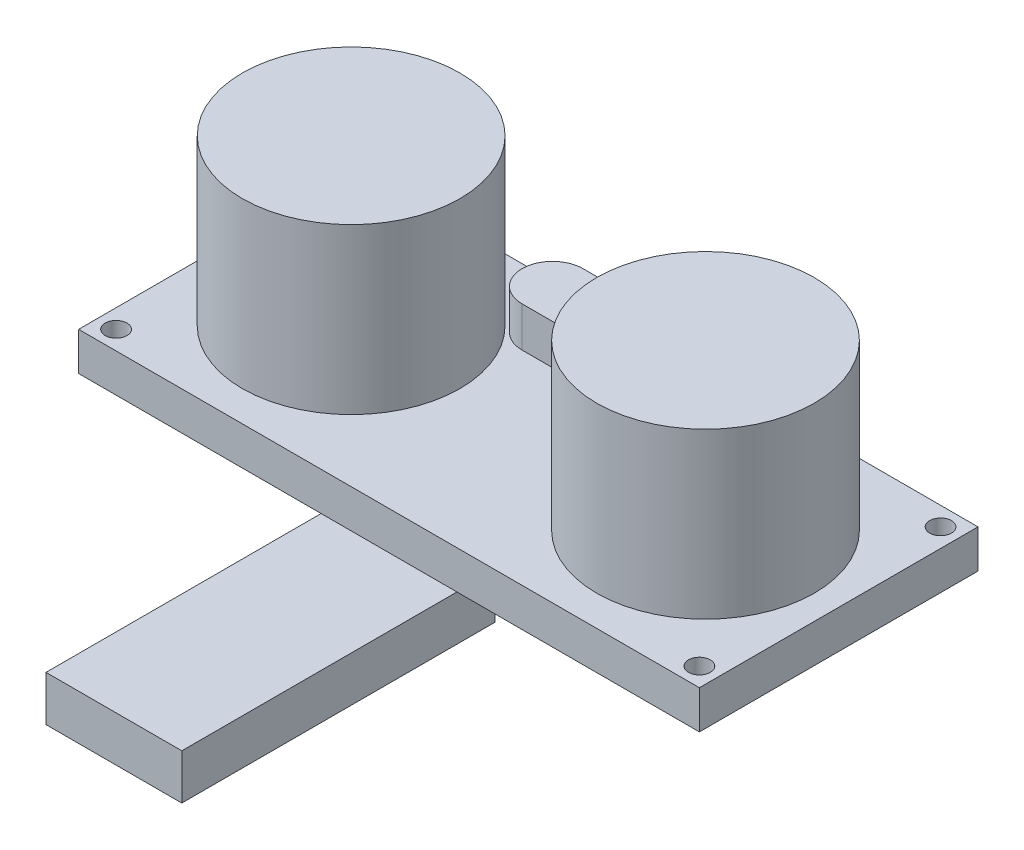
ISO-10303-21;
HEADER;
FILE_DESCRIPTION(('STEP AP214'),'2;1');
FILE_NAME('part.step','',(''),(''),'','','');
FILE_SCHEMA(('AUTOMOTIVE_DESIGN { 1 0 10303 214 1 1 1 1 }'));
ENDSEC;
DATA;
#1=APPLICATION_CONTEXT('core data for automotive mechanical design processes');
#2=APPLICATION_PROTOCOL_DEFINITION('international standard','automotive_design',2000,#1);
#3=PRODUCT_CONTEXT('',#1,'mechanical');
#4=PRODUCT('Part','Part','',(#3));
#5=PRODUCT_RELATED_PRODUCT_CATEGORY('part','',(#4));
#6=PRODUCT_DEFINITION_FORMATION('','',#4);
#7=PRODUCT_DEFINITION_CONTEXT('part definition',#1,'design');
#8=PRODUCT_DEFINITION('design','',#6,#7);
#9=PRODUCT_DEFINITION_SHAPE('','',#8);
#10=(LENGTH_UNIT() NAMED_UNIT(*) SI_UNIT(.MILLI.,.METRE.));
#11=(NAMED_UNIT(*) PLANE_ANGLE_UNIT() SI_UNIT($,.RADIAN.));
#12=(NAMED_UNIT(*) SI_UNIT($,.STERADIAN.) SOLID_ANGLE_UNIT());
#13=UNCERTAINTY_MEASURE_WITH_UNIT(LENGTH_MEASURE(1.E-05),#10,'distance_accuracy_value','');
#14=(GEOMETRIC_REPRESENTATION_CONTEXT(3) GLOBAL_UNCERTAINTY_ASSIGNED_CONTEXT((#13)) GLOBAL_UNIT_ASSIGNED_CONTEXT((#10,
#11,#12)) REPRESENTATION_CONTEXT('',''));
#15=CARTESIAN_POINT('',(0.,0.,0.));
#16=DIRECTION('',(0.,0.,1.));
#17=DIRECTION('',(1.,0.,0.));
#18=AXIS2_PLACEMENT_3D('',#15,#16,#17);
#19=CARTESIAN_POINT('',(-22.63775,2.794,10.16));
#20=DIRECTION('',(1.,0.,0.));
#21=DIRECTION('',(0.,0.,-1.));
#22=AXIS2_PLACEMENT_3D('',#19,#20,#21);
#23=PLANE('',#22);
#24=DIRECTION('',(0.,0.,1.));
#25=VECTOR('',#24,1.);
#26=CARTESIAN_POINT('',(-22.63775,0.,10.16));
#27=LINE('',#26,#25);
#28=CARTESIAN_POINT('',(-22.63775,0.,-10.16));
#29=VERTEX_POINT('',#28);
#30=CARTESIAN_POINT('',(-22.63775,0.,10.16));
#31=VERTEX_POINT('',#30);
#32=EDGE_CURVE('E238',#29,#31,#27,.T.);
#33=ORIENTED_EDGE('',*,*,#32,.T.);
#34=DIRECTION('',(0.,-1.,0.));
#35=VECTOR('',#34,1.);
#36=CARTESIAN_POINT('',(-22.63775,2.794,10.16));
#37=LINE('',#36,#35);
#38=CARTESIAN_POINT('',(-22.63775,2.794,10.16));
#39=VERTEX_POINT('',#38);
#40=EDGE_CURVE('E242',#39,#31,#37,.T.);
#41=ORIENTED_EDGE('',*,*,#40,.F.);
#42=DIRECTION('',(0.,0.,1.));
#43=VECTOR('',#42,1.);
#44=CARTESIAN_POINT('',(-22.63775,2.794,10.16));
#45=LINE('',#44,#43);
#46=CARTESIAN_POINT('',(-22.63775,2.794,-10.16));
#47=VERTEX_POINT('',#46);
#48=EDGE_CURVE('E247',#47,#39,#45,.T.);
#49=ORIENTED_EDGE('',*,*,#48,.F.);
#50=DIRECTION('',(0.,-1.,0.));
#51=VECTOR('',#50,1.);
#52=CARTESIAN_POINT('',(-22.63775,2.794,-10.16));
#53=LINE('',#52,#51);
#54=EDGE_CURVE('E263',#47,#29,#53,.T.);
#55=ORIENTED_EDGE('',*,*,#54,.T.);
#56=EDGE_LOOP('',(#33,#41,#49,#55));
#57=FACE_BOUND('',#56,.T.);
#58=ADVANCED_FACE('F42',(#57),#23,.F.);
#59=CARTESIAN_POINT('',(22.63775,2.794,10.16));
#60=DIRECTION('',(0.,0.,-1.));
#61=DIRECTION('',(-1.,0.,0.));
#62=AXIS2_PLACEMENT_3D('',#59,#60,#61);
#63=PLANE('',#62);
#64=DIRECTION('',(1.,0.,0.));
#65=VECTOR('',#64,1.);
#66=CARTESIAN_POINT('',(22.63775,0.,10.16));
#67=LINE('',#66,#65);
#68=CARTESIAN_POINT('',(-4.953,0.,10.16));
#69=VERTEX_POINT('',#68);
#70=EDGE_CURVE('E268',#31,#69,#67,.T.);
#71=ORIENTED_EDGE('',*,*,#70,.T.);
#72=CARTESIAN_POINT('',(4.953,0.,10.16));
#73=VERTEX_POINT('',#72);
#74=EDGE_CURVE('E272',#69,#73,#67,.T.);
#75=ORIENTED_EDGE('',*,*,#74,.T.);
#76=CARTESIAN_POINT('',(22.63775,0.,10.16));
#77=VERTEX_POINT('',#76);
#78=EDGE_CURVE('E270',#73,#77,#67,.T.);
#79=ORIENTED_EDGE('',*,*,#78,.T.);
#80=DIRECTION('',(0.,-1.,0.));
#81=VECTOR('',#80,1.);
#82=CARTESIAN_POINT('',(22.63775,2.794,10.16));
#83=LINE('',#82,#81);
#84=CARTESIAN_POINT('',(22.63775,2.794,10.16));
#85=VERTEX_POINT('',#84);
#86=EDGE_CURVE('E282',#85,#77,#83,.T.);
#87=ORIENTED_EDGE('',*,*,#86,.F.);
#88=DIRECTION('',(1.,0.,0.));
#89=VECTOR('',#88,1.);
#90=CARTESIAN_POINT('',(22.63775,2.794,10.16));
#91=LINE('',#90,#89);
#92=EDGE_CURVE('E251',#39,#85,#91,.T.);
#93=ORIENTED_EDGE('',*,*,#92,.F.);
#94=ORIENTED_EDGE('',*,*,#40,.T.);
#95=EDGE_LOOP('',(#71,#75,#79,#87,#93,#94));
#96=FACE_BOUND('',#95,.T.);
#97=ADVANCED_FACE('F328',(#96),#63,.F.);
#98=CARTESIAN_POINT('',(22.63775,2.794,10.16));
#99=DIRECTION('',(-1.,0.,0.));
#100=DIRECTION('',(0.,0.,1.));
#101=AXIS2_PLACEMENT_3D('',#98,#99,#100);
#102=PLANE('',#101);
#103=DIRECTION('',(0.,0.,-1.));
#104=VECTOR('',#103,1.);
#105=CARTESIAN_POINT('',(22.63775,0.,10.16));
#106=LINE('',#105,#104);
#107=CARTESIAN_POINT('',(22.63775,0.,-10.16));
#108=VERTEX_POINT('',#107);
#109=EDGE_CURVE('E275',#77,#108,#106,.T.);
#110=ORIENTED_EDGE('',*,*,#109,.T.);
#111=DIRECTION('',(0.,-1.,0.));
#112=VECTOR('',#111,1.);
#113=CARTESIAN_POINT('',(22.63775,2.794,-10.16));
#114=LINE('',#113,#112);
#115=CARTESIAN_POINT('',(22.63775,2.794,-10.16));
#116=VERTEX_POINT('',#115);
#117=EDGE_CURVE('E284',#116,#108,#114,.T.);
#118=ORIENTED_EDGE('',*,*,#117,.F.);
#119=DIRECTION('',(0.,0.,-1.));
#120=VECTOR('',#119,1.);
#121=CARTESIAN_POINT('',(22.63775,2.794,10.16));
#122=LINE('',#121,#120);
#123=EDGE_CURVE('E260',#85,#116,#122,.T.);
#124=ORIENTED_EDGE('',*,*,#123,.F.);
#125=ORIENTED_EDGE('',*,*,#86,.T.);
#126=EDGE_LOOP('',(#110,#118,#124,#125));
#127=FACE_BOUND('',#126,.T.);
#128=ADVANCED_FACE('F345',(#127),#102,.F.);
#129=CARTESIAN_POINT('',(22.63775,2.794,-10.16));
#130=DIRECTION('',(0.,0.,1.));
#131=DIRECTION('',(1.,0.,0.));
#132=AXIS2_PLACEMENT_3D('',#129,#130,#131);
#133=PLANE('',#132);
#134=DIRECTION('',(-1.,0.,0.));
#135=VECTOR('',#134,1.);
#136=CARTESIAN_POINT('',(22.63775,0.,-10.16));
#137=LINE('',#136,#135);
#138=EDGE_CURVE('E255',#108,#29,#137,.T.);
#139=ORIENTED_EDGE('',*,*,#138,.T.);
#140=ORIENTED_EDGE('',*,*,#54,.F.);
#141=DIRECTION('',(-1.,0.,0.));
#142=VECTOR('',#141,1.);
#143=CARTESIAN_POINT('',(22.63775,2.794,-10.16));
#144=LINE('',#143,#142);
#145=EDGE_CURVE('E257',#116,#47,#144,.T.);
#146=ORIENTED_EDGE('',*,*,#145,.F.);
#147=ORIENTED_EDGE('',*,*,#117,.T.);
#148=EDGE_LOOP('',(#139,#140,#146,#147));
#149=FACE_BOUND('',#148,.T.);
#150=ADVANCED_FACE('F340',(#149),#133,.F.);
#151=CARTESIAN_POINT('',(0.,2.794,0.));
#152=DIRECTION('',(0.,1.,0.));
#153=DIRECTION('',(0.,0.,1.));
#154=AXIS2_PLACEMENT_3D('',#151,#152,#153);
#155=PLANE('',#154);
#156=CARTESIAN_POINT('',(21.2725,2.794,-8.79475));
#157=DIRECTION('',(0.,1.,0.));
#158=DIRECTION('',(0.,0.,-1.));
#159=AXIS2_PLACEMENT_3D('',#156,#157,#158);
#160=CIRCLE('',#159,0.793749999999999);
#161=CARTESIAN_POINT('',(21.2725,2.794,-8.001));
#162=VERTEX_POINT('',#161);
#163=EDGE_CURVE('E555',#162,#162,#160,.T.);
#164=ORIENTED_EDGE('',*,*,#163,.F.);
#165=EDGE_LOOP('',(#164));
#166=FACE_BOUND('',#165,.T.);
#167=CARTESIAN_POINT('',(21.2725,2.794,8.79475));
#168=DIRECTION('',(0.,1.,0.));
#169=DIRECTION('',(0.,0.,1.));
#170=AXIS2_PLACEMENT_3D('',#167,#168,#169);
#171=CIRCLE('',#170,0.793749999999999);
#172=CARTESIAN_POINT('',(21.2725,2.794,9.5885));
#173=VERTEX_POINT('',#172);
#174=EDGE_CURVE('E551',#173,#173,#171,.T.);
#175=ORIENTED_EDGE('',*,*,#174,.F.);
#176=EDGE_LOOP('',(#175));
#177=FACE_BOUND('',#176,.T.);
#178=CARTESIAN_POINT('',(-21.2725,2.794,8.79475));
#179=DIRECTION('',(0.,1.,0.));
#180=DIRECTION('',(0.,0.,-1.));
#181=AXIS2_PLACEMENT_3D('',#178,#179,#180);
#182=CIRCLE('',#181,0.793749999999999);
#183=CARTESIAN_POINT('',(-21.2725,2.794,9.5885));
#184=VERTEX_POINT('',#183);
#185=EDGE_CURVE('E560',#184,#184,#182,.T.);
#186=ORIENTED_EDGE('',*,*,#185,.F.);
#187=EDGE_LOOP('',(#186));
#188=FACE_BOUND('',#187,.T.);
#189=CARTESIAN_POINT('',(-21.2725,2.794,-8.79475));
#190=DIRECTION('',(0.,1.,0.));
#191=DIRECTION('',(0.,0.,1.));
#192=AXIS2_PLACEMENT_3D('',#189,#190,#191);
#193=CIRCLE('',#192,0.793749999999999);
#194=CARTESIAN_POINT('',(-21.2725,2.794,-8.001));
#195=VERTEX_POINT('',#194);
#196=EDGE_CURVE('E296',#195,#195,#193,.T.);
#197=ORIENTED_EDGE('',*,*,#196,.F.);
#198=EDGE_LOOP('',(#197));
#199=FACE_BOUND('',#198,.T.);
#200=CARTESIAN_POINT('',(5.1564161456399,2.794,-6.9215));
#201=DIRECTION('',(0.,1.,0.));
#202=DIRECTION('',(0.,0.,1.));
#203=AXIS2_PLACEMENT_3D('',#200,#201,#202);
#204=CIRCLE('',#203,2.2225);
#205=CARTESIAN_POINT('',(5.1564161456399,2.794,-4.699));
#206=VERTEX_POINT('',#205);
#207=CARTESIAN_POINT('',(5.1564161456399,2.794,-9.144));
#208=VERTEX_POINT('',#207);
#209=EDGE_CURVE('E216',#206,#208,#204,.T.);
#210=ORIENTED_EDGE('',*,*,#209,.F.);
#211=DIRECTION('',(1.,0.,0.));
#212=VECTOR('',#211,1.);
#213=CARTESIAN_POINT('',(0.,2.794,-4.699));
#214=LINE('',#213,#212);
#215=CARTESIAN_POINT('',(-5.1564161456399,2.794,-4.699));
#216=VERTEX_POINT('',#215);
#217=EDGE_CURVE('E147',#216,#206,#214,.T.);
#218=ORIENTED_EDGE('',*,*,#217,.F.);
#219=CARTESIAN_POINT('',(-5.1564161456399,2.794,-6.9215));
#220=DIRECTION('',(0.,1.,0.));
#221=DIRECTION('',(0.,0.,1.));
#222=AXIS2_PLACEMENT_3D('',#219,#220,#221);
#223=CIRCLE('',#222,2.2225);
#224=CARTESIAN_POINT('',(-5.1564161456399,2.794,-9.144));
#225=VERTEX_POINT('',#224);
#226=EDGE_CURVE('E205',#225,#216,#223,.T.);
#227=ORIENTED_EDGE('',*,*,#226,.F.);
#228=DIRECTION('',(1.,0.,0.));
#229=VECTOR('',#228,1.);
#230=CARTESIAN_POINT('',(0.,2.794,-9.144));
#231=LINE('',#230,#229);
#232=EDGE_CURVE('E67',#225,#208,#231,.T.);
#233=ORIENTED_EDGE('',*,*,#232,.T.);
#234=EDGE_LOOP('',(#210,#218,#227,#233));
#235=FACE_BOUND('',#234,.T.);
#236=CARTESIAN_POINT('',(-12.92225,2.794,0.));
#237=DIRECTION('',(0.,1.,0.));
#238=DIRECTION('',(0.,0.,1.));
#239=AXIS2_PLACEMENT_3D('',#236,#237,#238);
#240=CIRCLE('',#239,7.9375);
#241=CARTESIAN_POINT('',(-12.92225,2.794,7.9375));
#242=VERTEX_POINT('',#241);
#243=EDGE_CURVE('E11',#242,#242,#240,.T.);
#244=ORIENTED_EDGE('',*,*,#243,.F.);
#245=EDGE_LOOP('',(#244));
#246=FACE_BOUND('',#245,.T.);
#247=CARTESIAN_POINT('',(12.92225,2.794,0.));
#248=DIRECTION('',(0.,1.,0.));
#249=DIRECTION('',(0.,0.,-1.));
#250=AXIS2_PLACEMENT_3D('',#247,#248,#249);
#251=CIRCLE('',#250,7.9375);
#252=CARTESIAN_POINT('',(12.92225,2.794,-7.93750000000002));
#253=VERTEX_POINT('',#252);
#254=EDGE_CURVE('E52',#253,#253,#251,.T.);
#255=ORIENTED_EDGE('',*,*,#254,.F.);
#256=EDGE_LOOP('',(#255));
#257=FACE_BOUND('',#256,.T.);
#258=ORIENTED_EDGE('',*,*,#48,.T.);
#259=ORIENTED_EDGE('',*,*,#92,.T.);
#260=ORIENTED_EDGE('',*,*,#123,.T.);
#261=ORIENTED_EDGE('',*,*,#145,.T.);
#262=EDGE_LOOP('',(#258,#259,#260,#261));
#263=FACE_BOUND('',#262,.T.);
#264=ADVANCED_FACE('F342',(#166,#177,#188,#199,#235,#246,#257,#263),#155,.T.);
#265=CARTESIAN_POINT('',(0.,0.,0.));
#266=DIRECTION('',(0.,1.,0.));
#267=DIRECTION('',(0.,0.,1.));
#268=AXIS2_PLACEMENT_3D('',#265,#266,#267);
#269=PLANE('',#268);
#270=CARTESIAN_POINT('',(21.2725,0.,-8.79475));
#271=DIRECTION('',(0.,1.,0.));
#272=DIRECTION('',(0.,0.,1.));
#273=AXIS2_PLACEMENT_3D('',#270,#271,#272);
#274=CIRCLE('',#273,0.793749999999999);
#275=CARTESIAN_POINT('',(21.2725,0.,-8.001));
#276=VERTEX_POINT('',#275);
#277=EDGE_CURVE('E50',#276,#276,#274,.T.);
#278=ORIENTED_EDGE('',*,*,#277,.T.);
#279=EDGE_LOOP('',(#278));
#280=FACE_BOUND('',#279,.T.);
#281=CARTESIAN_POINT('',(21.2725,0.,8.79475));
#282=DIRECTION('',(0.,1.,0.));
#283=DIRECTION('',(0.,0.,1.));
#284=AXIS2_PLACEMENT_3D('',#281,#282,#283);
#285=CIRCLE('',#284,0.793749999999999);
#286=CARTESIAN_POINT('',(21.2725,0.,9.5885));
#287=VERTEX_POINT('',#286);
#288=EDGE_CURVE('E297',#287,#287,#285,.T.);
#289=ORIENTED_EDGE('',*,*,#288,.T.);
#290=EDGE_LOOP('',(#289));
#291=FACE_BOUND('',#290,.T.);
#292=CARTESIAN_POINT('',(-21.2725,0.,8.79475));
#293=DIRECTION('',(0.,1.,0.));
#294=DIRECTION('',(0.,0.,1.));
#295=AXIS2_PLACEMENT_3D('',#292,#293,#294);
#296=CIRCLE('',#295,0.793749999999999);
#297=CARTESIAN_POINT('',(-21.2725,0.,9.5885));
#298=VERTEX_POINT('',#297);
#299=EDGE_CURVE('E299',#298,#298,#296,.T.);
#300=ORIENTED_EDGE('',*,*,#299,.T.);
#301=EDGE_LOOP('',(#300));
#302=FACE_BOUND('',#301,.T.);
#303=CARTESIAN_POINT('',(-21.2725,0.,-8.79475));
#304=DIRECTION('',(0.,1.,0.));
#305=DIRECTION('',(0.,0.,1.));
#306=AXIS2_PLACEMENT_3D('',#303,#304,#305);
#307=CIRCLE('',#306,0.793749999999999);
#308=CARTESIAN_POINT('',(-21.2725,0.,-8.001));
#309=VERTEX_POINT('',#308);
#310=EDGE_CURVE('E295',#309,#309,#307,.T.);
#311=ORIENTED_EDGE('',*,*,#310,.T.);
#312=EDGE_LOOP('',(#311));
#313=FACE_BOUND('',#312,.T.);
#314=DIRECTION('',(-1.,0.,0.));
#315=VECTOR('',#314,1.);
#316=CARTESIAN_POINT('',(0.,0.,7.366));
#317=LINE('',#316,#315);
#318=CARTESIAN_POINT('',(4.953,0.,7.366));
#319=VERTEX_POINT('',#318);
#320=CARTESIAN_POINT('',(-4.953,0.,7.366));
#321=VERTEX_POINT('',#320);
#322=EDGE_CURVE('E180',#319,#321,#317,.T.);
#323=ORIENTED_EDGE('',*,*,#322,.T.);
#324=DIRECTION('',(0.,0.,1.));
#325=VECTOR('',#324,1.);
#326=CARTESIAN_POINT('',(-4.953,0.,0.));
#327=LINE('',#326,#325);
#328=EDGE_CURVE('E64',#321,#69,#327,.T.);
#329=ORIENTED_EDGE('',*,*,#328,.T.);
#330=ORIENTED_EDGE('',*,*,#70,.F.);
#331=ORIENTED_EDGE('',*,*,#32,.F.);
#332=ORIENTED_EDGE('',*,*,#138,.F.);
#333=ORIENTED_EDGE('',*,*,#109,.F.);
#334=ORIENTED_EDGE('',*,*,#78,.F.);
#335=DIRECTION('',(0.,0.,1.));
#336=VECTOR('',#335,1.);
#337=CARTESIAN_POINT('',(4.953,0.,0.));
#338=LINE('',#337,#336);
#339=EDGE_CURVE('E185',#319,#73,#338,.T.);
#340=ORIENTED_EDGE('',*,*,#339,.F.);
#341=EDGE_LOOP('',(#323,#329,#330,#331,#332,#333,#334,#340));
#342=FACE_BOUND('',#341,.T.);
#343=ADVANCED_FACE('F322',(#280,#291,#302,#313,#342),#269,.F.);
#344=CARTESIAN_POINT('',(12.92225,14.7955,0.));
#345=DIRECTION('',(0.,-1.,0.));
#346=DIRECTION('',(0.,0.,-1.));
#347=AXIS2_PLACEMENT_3D('',#344,#345,#346);
#348=CYLINDRICAL_SURFACE('',#347,7.9375);
#349=CARTESIAN_POINT('',(12.92225,14.7955,0.));
#350=DIRECTION('',(0.,1.,0.));
#351=DIRECTION('',(0.,0.,-1.));
#352=AXIS2_PLACEMENT_3D('',#349,#350,#351);
#353=CIRCLE('',#352,7.9375);
#354=CARTESIAN_POINT('',(12.92225,14.7955,-7.93750000000002));
#355=VERTEX_POINT('',#354);
#356=EDGE_CURVE('E237',#355,#355,#353,.T.);
#357=ORIENTED_EDGE('',*,*,#356,.F.);
#358=EDGE_LOOP('',(#357));
#359=FACE_BOUND('',#358,.T.);
#360=ORIENTED_EDGE('',*,*,#254,.T.);
#361=EDGE_LOOP('',(#360));
#362=FACE_BOUND('',#361,.T.);
#363=ADVANCED_FACE('F351',(#359,#362),#348,.T.);
#364=CARTESIAN_POINT('',(12.92225,14.7955,0.));
#365=DIRECTION('',(0.,-1.,0.));
#366=DIRECTION('',(0.,0.,-1.));
#367=AXIS2_PLACEMENT_3D('',#364,#365,#366);
#368=PLANE('',#367);
#369=ORIENTED_EDGE('',*,*,#356,.T.);
#370=EDGE_LOOP('',(#369));
#371=FACE_BOUND('',#370,.T.);
#372=ADVANCED_FACE('F382',(#371),#368,.F.);
#373=CARTESIAN_POINT('',(-12.92225,14.7955,0.));
#374=DIRECTION('',(0.,-1.,0.));
#375=DIRECTION('',(0.,0.,-1.));
#376=AXIS2_PLACEMENT_3D('',#373,#374,#375);
#377=CYLINDRICAL_SURFACE('',#376,7.9375);
#378=CARTESIAN_POINT('',(-12.92225,14.7955,0.));
#379=DIRECTION('',(0.,1.,0.));
#380=DIRECTION('',(0.,0.,1.));
#381=AXIS2_PLACEMENT_3D('',#378,#379,#380);
#382=CIRCLE('',#381,7.9375);
#383=CARTESIAN_POINT('',(-12.92225,14.7955,7.9375));
#384=VERTEX_POINT('',#383);
#385=EDGE_CURVE('E240',#384,#384,#382,.T.);
#386=ORIENTED_EDGE('',*,*,#385,.F.);
#387=EDGE_LOOP('',(#386));
#388=FACE_BOUND('',#387,.T.);
#389=ORIENTED_EDGE('',*,*,#243,.T.);
#390=EDGE_LOOP('',(#389));
#391=FACE_BOUND('',#390,.T.);
#392=ADVANCED_FACE('F395',(#388,#391),#377,.T.);
#393=CARTESIAN_POINT('',(-12.92225,14.7955,0.));
#394=DIRECTION('',(0.,1.,0.));
#395=DIRECTION('',(0.,0.,1.));
#396=AXIS2_PLACEMENT_3D('',#393,#394,#395);
#397=PLANE('',#396);
#398=ORIENTED_EDGE('',*,*,#385,.T.);
#399=EDGE_LOOP('',(#398));
#400=FACE_BOUND('',#399,.T.);
#401=ADVANCED_FACE('F402',(#400),#397,.T.);
#402=CARTESIAN_POINT('',(0.,5.715,-4.699));
#403=DIRECTION('',(0.,0.,-1.));
#404=DIRECTION('',(-1.,0.,0.));
#405=AXIS2_PLACEMENT_3D('',#402,#403,#404);
#406=PLANE('',#405);
#407=ORIENTED_EDGE('',*,*,#217,.T.);
#408=DIRECTION('',(0.,-1.,0.));
#409=VECTOR('',#408,1.);
#410=CARTESIAN_POINT('',(5.1564161456399,5.715,-4.699));
#411=LINE('',#410,#409);
#412=CARTESIAN_POINT('',(5.1564161456399,5.715,-4.699));
#413=VERTEX_POINT('',#412);
#414=EDGE_CURVE('E233',#413,#206,#411,.T.);
#415=ORIENTED_EDGE('',*,*,#414,.F.);
#416=DIRECTION('',(1.,0.,0.));
#417=VECTOR('',#416,1.);
#418=CARTESIAN_POINT('',(0.,5.715,-4.699));
#419=LINE('',#418,#417);
#420=CARTESIAN_POINT('',(-5.1564161456399,5.715,-4.699));
#421=VERTEX_POINT('',#420);
#422=EDGE_CURVE('E197',#421,#413,#419,.T.);
#423=ORIENTED_EDGE('',*,*,#422,.F.);
#424=DIRECTION('',(0.,-1.,0.));
#425=VECTOR('',#424,1.);
#426=CARTESIAN_POINT('',(-5.1564161456399,5.715,-4.699));
#427=LINE('',#426,#425);
#428=EDGE_CURVE('E215',#421,#216,#427,.T.);
#429=ORIENTED_EDGE('',*,*,#428,.T.);
#430=EDGE_LOOP('',(#407,#415,#423,#429));
#431=FACE_BOUND('',#430,.T.);
#432=ADVANCED_FACE('F407',(#431),#406,.F.);
#433=CARTESIAN_POINT('',(5.1564161456399,5.715,-6.9215));
#434=DIRECTION('',(0.,-1.,0.));
#435=DIRECTION('',(0.,0.,-1.));
#436=AXIS2_PLACEMENT_3D('',#433,#434,#435);
#437=CYLINDRICAL_SURFACE('',#436,2.2225);
#438=ORIENTED_EDGE('',*,*,#209,.T.);
#439=DIRECTION('',(0.,-1.,0.));
#440=VECTOR('',#439,1.);
#441=CARTESIAN_POINT('',(5.1564161456399,5.715,-9.144));
#442=LINE('',#441,#440);
#443=CARTESIAN_POINT('',(5.1564161456399,5.715,-9.144));
#444=VERTEX_POINT('',#443);
#445=EDGE_CURVE('E227',#444,#208,#442,.T.);
#446=ORIENTED_EDGE('',*,*,#445,.F.);
#447=CARTESIAN_POINT('',(5.1564161456399,5.715,-6.9215));
#448=DIRECTION('',(0.,1.,0.));
#449=DIRECTION('',(0.,0.,1.));
#450=AXIS2_PLACEMENT_3D('',#447,#448,#449);
#451=CIRCLE('',#450,2.2225);
#452=EDGE_CURVE('E203',#413,#444,#451,.T.);
#453=ORIENTED_EDGE('',*,*,#452,.F.);
#454=ORIENTED_EDGE('',*,*,#414,.T.);
#455=EDGE_LOOP('',(#438,#446,#453,#454));
#456=FACE_BOUND('',#455,.T.);
#457=ADVANCED_FACE('F420',(#456),#437,.T.);
#458=CARTESIAN_POINT('',(0.,5.715,-9.144));
#459=DIRECTION('',(0.,0.,-1.));
#460=DIRECTION('',(-1.,0.,0.));
#461=AXIS2_PLACEMENT_3D('',#458,#459,#460);
#462=PLANE('',#461);
#463=ORIENTED_EDGE('',*,*,#232,.F.);
#464=DIRECTION('',(0.,-1.,0.));
#465=VECTOR('',#464,1.);
#466=CARTESIAN_POINT('',(-5.1564161456399,5.715,-9.144));
#467=LINE('',#466,#465);
#468=CARTESIAN_POINT('',(-5.1564161456399,5.715,-9.144));
#469=VERTEX_POINT('',#468);
#470=EDGE_CURVE('E226',#469,#225,#467,.T.);
#471=ORIENTED_EDGE('',*,*,#470,.F.);
#472=DIRECTION('',(1.,0.,0.));
#473=VECTOR('',#472,1.);
#474=CARTESIAN_POINT('',(0.,5.715,-9.144));
#475=LINE('',#474,#473);
#476=EDGE_CURVE('E202',#469,#444,#475,.T.);
#477=ORIENTED_EDGE('',*,*,#476,.T.);
#478=ORIENTED_EDGE('',*,*,#445,.T.);
#479=EDGE_LOOP('',(#463,#471,#477,#478));
#480=FACE_BOUND('',#479,.T.);
#481=ADVANCED_FACE('F428',(#480),#462,.T.);
#482=CARTESIAN_POINT('',(-5.1564161456399,5.715,-6.9215));
#483=DIRECTION('',(0.,-1.,0.));
#484=DIRECTION('',(0.,0.,-1.));
#485=AXIS2_PLACEMENT_3D('',#482,#483,#484);
#486=CYLINDRICAL_SURFACE('',#485,2.2225);
#487=ORIENTED_EDGE('',*,*,#226,.T.);
#488=ORIENTED_EDGE('',*,*,#428,.F.);
#489=CARTESIAN_POINT('',(-5.1564161456399,5.715,-6.9215));
#490=DIRECTION('',(0.,1.,0.));
#491=DIRECTION('',(0.,0.,1.));
#492=AXIS2_PLACEMENT_3D('',#489,#490,#491);
#493=CIRCLE('',#492,2.2225);
#494=EDGE_CURVE('E207',#469,#421,#493,.T.);
#495=ORIENTED_EDGE('',*,*,#494,.F.);
#496=ORIENTED_EDGE('',*,*,#470,.T.);
#497=EDGE_LOOP('',(#487,#488,#495,#496));
#498=FACE_BOUND('',#497,.T.);
#499=ADVANCED_FACE('F440',(#498),#486,.T.);
#500=CARTESIAN_POINT('',(0.,5.715,0.));
#501=DIRECTION('',(0.,1.,0.));
#502=DIRECTION('',(0.,0.,1.));
#503=AXIS2_PLACEMENT_3D('',#500,#501,#502);
#504=PLANE('',#503);
#505=ORIENTED_EDGE('',*,*,#422,.T.);
#506=ORIENTED_EDGE('',*,*,#452,.T.);
#507=ORIENTED_EDGE('',*,*,#476,.F.);
#508=ORIENTED_EDGE('',*,*,#494,.T.);
#509=EDGE_LOOP('',(#505,#506,#507,#508));
#510=FACE_BOUND('',#509,.T.);
#511=ADVANCED_FACE('F441',(#510),#504,.T.);
#512=CARTESIAN_POINT('',(-4.953,-3.302,0.));
#513=DIRECTION('',(-1.,0.,0.));
#514=DIRECTION('',(0.,0.,1.));
#515=AXIS2_PLACEMENT_3D('',#512,#513,#514);
#516=PLANE('',#515);
#517=ORIENTED_EDGE('',*,*,#328,.F.);
#518=DIRECTION('',(0.,1.,0.));
#519=VECTOR('',#518,1.);
#520=CARTESIAN_POINT('',(-4.953,-3.302,7.366));
#521=LINE('',#520,#519);
#522=CARTESIAN_POINT('',(-4.953,-3.302,7.366));
#523=VERTEX_POINT('',#522);
#524=EDGE_CURVE('E139',#523,#321,#521,.T.);
#525=ORIENTED_EDGE('',*,*,#524,.F.);
#526=DIRECTION('',(0.,0.,1.));
#527=VECTOR('',#526,1.);
#528=CARTESIAN_POINT('',(-4.953,-3.302,0.));
#529=LINE('',#528,#527);
#530=CARTESIAN_POINT('',(-4.953,-3.302,30.226));
#531=VERTEX_POINT('',#530);
#532=EDGE_CURVE('E145',#523,#531,#529,.T.);
#533=ORIENTED_EDGE('',*,*,#532,.T.);
#534=DIRECTION('',(0.,1.,0.));
#535=VECTOR('',#534,1.);
#536=CARTESIAN_POINT('',(-4.953,-3.302,30.226));
#537=LINE('',#536,#535);
#538=CARTESIAN_POINT('',(-4.953,0.,30.226));
#539=VERTEX_POINT('',#538);
#540=EDGE_CURVE('E173',#531,#539,#537,.T.);
#541=ORIENTED_EDGE('',*,*,#540,.T.);
#542=EDGE_CURVE('E178',#69,#539,#327,.T.);
#543=ORIENTED_EDGE('',*,*,#542,.F.);
#544=EDGE_LOOP('',(#517,#525,#533,#541,#543));
#545=FACE_BOUND('',#544,.T.);
#546=ADVANCED_FACE('F142',(#545),#516,.T.);
#547=CARTESIAN_POINT('',(0.,-3.302,7.366));
#548=DIRECTION('',(0.,0.,-1.));
#549=DIRECTION('',(-1.,0.,0.));
#550=AXIS2_PLACEMENT_3D('',#547,#548,#549);
#551=PLANE('',#550);
#552=ORIENTED_EDGE('',*,*,#322,.F.);
#553=DIRECTION('',(0.,1.,0.));
#554=VECTOR('',#553,1.);
#555=CARTESIAN_POINT('',(4.953,-3.302,7.366));
#556=LINE('',#555,#554);
#557=CARTESIAN_POINT('',(4.953,-3.302,7.366));
#558=VERTEX_POINT('',#557);
#559=EDGE_CURVE('E151',#558,#319,#556,.T.);
#560=ORIENTED_EDGE('',*,*,#559,.F.);
#561=DIRECTION('',(-1.,0.,0.));
#562=VECTOR('',#561,1.);
#563=CARTESIAN_POINT('',(0.,-3.302,7.366));
#564=LINE('',#563,#562);
#565=EDGE_CURVE('E156',#558,#523,#564,.T.);
#566=ORIENTED_EDGE('',*,*,#565,.T.);
#567=ORIENTED_EDGE('',*,*,#524,.T.);
#568=EDGE_LOOP('',(#552,#560,#566,#567));
#569=FACE_BOUND('',#568,.T.);
#570=ADVANCED_FACE('F162',(#569),#551,.T.);
#571=CARTESIAN_POINT('',(4.953,-3.302,0.));
#572=DIRECTION('',(-1.,0.,0.));
#573=DIRECTION('',(0.,0.,1.));
#574=AXIS2_PLACEMENT_3D('',#571,#572,#573);
#575=PLANE('',#574);
#576=ORIENTED_EDGE('',*,*,#339,.T.);
#577=CARTESIAN_POINT('',(4.953,0.,30.226));
#578=VERTEX_POINT('',#577);
#579=EDGE_CURVE('E182',#73,#578,#338,.T.);
#580=ORIENTED_EDGE('',*,*,#579,.T.);
#581=DIRECTION('',(0.,1.,0.));
#582=VECTOR('',#581,1.);
#583=CARTESIAN_POINT('',(4.953,-3.302,30.226));
#584=LINE('',#583,#582);
#585=CARTESIAN_POINT('',(4.953,-3.302,30.226));
#586=VERTEX_POINT('',#585);
#587=EDGE_CURVE('E191',#586,#578,#584,.T.);
#588=ORIENTED_EDGE('',*,*,#587,.F.);
#589=DIRECTION('',(0.,0.,1.));
#590=VECTOR('',#589,1.);
#591=CARTESIAN_POINT('',(4.953,-3.302,0.));
#592=LINE('',#591,#590);
#593=EDGE_CURVE('E167',#558,#586,#592,.T.);
#594=ORIENTED_EDGE('',*,*,#593,.F.);
#595=ORIENTED_EDGE('',*,*,#559,.T.);
#596=EDGE_LOOP('',(#576,#580,#588,#594,#595));
#597=FACE_BOUND('',#596,.T.);
#598=ADVANCED_FACE('F318',(#597),#575,.F.);
#599=CARTESIAN_POINT('',(0.,-3.302,30.226));
#600=DIRECTION('',(0.,0.,-1.));
#601=DIRECTION('',(-1.,0.,0.));
#602=AXIS2_PLACEMENT_3D('',#599,#600,#601);
#603=PLANE('',#602);
#604=DIRECTION('',(-1.,0.,0.));
#605=VECTOR('',#604,1.);
#606=CARTESIAN_POINT('',(0.,0.,30.226));
#607=LINE('',#606,#605);
#608=EDGE_CURVE('E161',#578,#539,#607,.T.);
#609=ORIENTED_EDGE('',*,*,#608,.T.);
#610=ORIENTED_EDGE('',*,*,#540,.F.);
#611=DIRECTION('',(-1.,0.,0.));
#612=VECTOR('',#611,1.);
#613=CARTESIAN_POINT('',(0.,-3.302,30.226));
#614=LINE('',#613,#612);
#615=EDGE_CURVE('E158',#586,#531,#614,.T.);
#616=ORIENTED_EDGE('',*,*,#615,.F.);
#617=ORIENTED_EDGE('',*,*,#587,.T.);
#618=EDGE_LOOP('',(#609,#610,#616,#617));
#619=FACE_BOUND('',#618,.T.);
#620=ADVANCED_FACE('F312',(#619),#603,.F.);
#621=CARTESIAN_POINT('',(0.,-3.302,0.));
#622=DIRECTION('',(0.,-1.,0.));
#623=DIRECTION('',(0.,0.,-1.));
#624=AXIS2_PLACEMENT_3D('',#621,#622,#623);
#625=PLANE('',#624);
#626=ORIENTED_EDGE('',*,*,#532,.F.);
#627=ORIENTED_EDGE('',*,*,#565,.F.);
#628=ORIENTED_EDGE('',*,*,#593,.T.);
#629=ORIENTED_EDGE('',*,*,#615,.T.);
#630=EDGE_LOOP('',(#626,#627,#628,#629));
#631=FACE_BOUND('',#630,.T.);
#632=ADVANCED_FACE('F154',(#631),#625,.T.);
#633=CARTESIAN_POINT('',(0.,0.,0.));
#634=DIRECTION('',(0.,-1.,0.));
#635=DIRECTION('',(0.,0.,-1.));
#636=AXIS2_PLACEMENT_3D('',#633,#634,#635);
#637=PLANE('',#636);
#638=ORIENTED_EDGE('',*,*,#74,.F.);
#639=ORIENTED_EDGE('',*,*,#542,.T.);
#640=ORIENTED_EDGE('',*,*,#608,.F.);
#641=ORIENTED_EDGE('',*,*,#579,.F.);
#642=EDGE_LOOP('',(#638,#639,#640,#641));
#643=FACE_BOUND('',#642,.T.);
#644=ADVANCED_FACE('F315',(#643),#637,.F.);
#645=CARTESIAN_POINT('',(-21.2725,-3.302,-8.79475));
#646=DIRECTION('',(0.,1.,0.));
#647=DIRECTION('',(0.,0.,1.));
#648=AXIS2_PLACEMENT_3D('',#645,#646,#647);
#649=CYLINDRICAL_SURFACE('',#648,0.793749999999999);
#650=CARTESIAN_POINT('',(-21.2725,2.794,-8.001));
#651=CARTESIAN_POINT('',(-21.2725,2.76489583333333,-8.001));
#652=CARTESIAN_POINT('',(-21.2725,2.73579166666667,-8.001));
#653=CARTESIAN_POINT('',(-21.2725,2.67758333333333,-8.001));
#654=CARTESIAN_POINT('',(-21.2725,2.64847916666667,-8.001));
#655=CARTESIAN_POINT('',(-21.2725,2.59027083333333,-8.001));
#656=CARTESIAN_POINT('',(-21.2725,2.56116666666667,-8.001));
#657=CARTESIAN_POINT('',(-21.2725,2.50295833333333,-8.001));
#658=CARTESIAN_POINT('',(-21.2725,2.47385416666667,-8.001));
#659=CARTESIAN_POINT('',(-21.2725,2.41564583333333,-8.001));
#660=CARTESIAN_POINT('',(-21.2725,2.38654166666667,-8.001));
#661=CARTESIAN_POINT('',(-21.2725,2.32833333333333,-8.001));
#662=CARTESIAN_POINT('',(-21.2725,2.29922916666667,-8.001));
#663=CARTESIAN_POINT('',(-21.2725,2.24102083333333,-8.001));
#664=CARTESIAN_POINT('',(-21.2725,2.21191666666667,-8.001));
#665=CARTESIAN_POINT('',(-21.2725,2.15370833333333,-8.001));
#666=CARTESIAN_POINT('',(-21.2725,2.12460416666667,-8.001));
#667=CARTESIAN_POINT('',(-21.2725,2.06639583333333,-8.001));
#668=CARTESIAN_POINT('',(-21.2725,2.03729166666667,-8.001));
#669=CARTESIAN_POINT('',(-21.2725,1.97908333333333,-8.001));
#670=CARTESIAN_POINT('',(-21.2725,1.94997916666667,-8.001));
#671=CARTESIAN_POINT('',(-21.2725,1.89177083333333,-8.001));
#672=CARTESIAN_POINT('',(-21.2725,1.86266666666667,-8.001));
#673=CARTESIAN_POINT('',(-21.2725,1.80445833333333,-8.001));
#674=CARTESIAN_POINT('',(-21.2725,1.77535416666667,-8.001));
#675=CARTESIAN_POINT('',(-21.2725,1.71714583333333,-8.001));
#676=CARTESIAN_POINT('',(-21.2725,1.68804166666667,-8.001));
#677=CARTESIAN_POINT('',(-21.2725,1.62983333333333,-8.001));
#678=CARTESIAN_POINT('',(-21.2725,1.60072916666667,-8.001));
#679=CARTESIAN_POINT('',(-21.2725,1.54252083333333,-8.001));
#680=CARTESIAN_POINT('',(-21.2725,1.51341666666667,-8.001));
#681=CARTESIAN_POINT('',(-21.2725,1.45520833333333,-8.001));
#682=CARTESIAN_POINT('',(-21.2725,1.42610416666667,-8.001));
#683=CARTESIAN_POINT('',(-21.2725,1.36789583333333,-8.001));
#684=CARTESIAN_POINT('',(-21.2725,1.33879166666667,-8.001));
#685=CARTESIAN_POINT('',(-21.2725,1.28058333333333,-8.001));
#686=CARTESIAN_POINT('',(-21.2725,1.25147916666667,-8.001));
#687=CARTESIAN_POINT('',(-21.2725,1.19327083333333,-8.001));
#688=CARTESIAN_POINT('',(-21.2725,1.16416666666667,-8.001));
#689=CARTESIAN_POINT('',(-21.2725,1.10595833333333,-8.001));
#690=CARTESIAN_POINT('',(-21.2725,1.07685416666667,-8.001));
#691=CARTESIAN_POINT('',(-21.2725,1.01864583333333,-8.001));
#692=CARTESIAN_POINT('',(-21.2725,0.989541666666667,-8.001));
#693=CARTESIAN_POINT('',(-21.2725,0.931333333333333,-8.001));
#694=CARTESIAN_POINT('',(-21.2725,0.902229166666666,-8.001));
#695=CARTESIAN_POINT('',(-21.2725,0.844020833333333,-8.001));
#696=CARTESIAN_POINT('',(-21.2725,0.814916666666666,-8.001));
#697=CARTESIAN_POINT('',(-21.2725,0.756708333333333,-8.001));
#698=CARTESIAN_POINT('',(-21.2725,0.727604166666666,-8.001));
#699=CARTESIAN_POINT('',(-21.2725,0.669395833333333,-8.001));
#700=CARTESIAN_POINT('',(-21.2725,0.640291666666666,-8.001));
#701=CARTESIAN_POINT('',(-21.2725,0.582083333333333,-8.001));
#702=CARTESIAN_POINT('',(-21.2725,0.552979166666666,-8.001));
#703=CARTESIAN_POINT('',(-21.2725,0.494770833333333,-8.001));
#704=CARTESIAN_POINT('',(-21.2725,0.465666666666667,-8.001));
#705=CARTESIAN_POINT('',(-21.2725,0.407458333333333,-8.001));
#706=CARTESIAN_POINT('',(-21.2725,0.378354166666667,-8.001));
#707=CARTESIAN_POINT('',(-21.2725,0.320145833333333,-8.001));
#708=CARTESIAN_POINT('',(-21.2725,0.291041666666667,-8.001));
#709=CARTESIAN_POINT('',(-21.2725,0.232833333333333,-8.001));
#710=CARTESIAN_POINT('',(-21.2725,0.203729166666667,-8.001));
#711=CARTESIAN_POINT('',(-21.2725,0.145520833333333,-8.001));
#712=CARTESIAN_POINT('',(-21.2725,0.116416666666667,-8.001));
#713=CARTESIAN_POINT('',(-21.2725,0.0582083333333334,-8.001));
#714=CARTESIAN_POINT('',(-21.2725,0.0291041666666667,-8.001));
#715=CARTESIAN_POINT('',(-21.2725,0.,-8.001));
#716=B_SPLINE_CURVE_WITH_KNOTS('',3,(#650,#651,#652,#653,#654,#655,#656,#657,#658,#659,#660,
#661,#662,#663,#664,#665,#666,#667,#668,#669,#670,#671,#672,#673,#674,#675,#676,#677,#678,#679,
#680,#681,#682,#683,#684,#685,#686,#687,#688,#689,#690,#691,#692,#693,#694,#695,#696,#697,#698,
#699,#700,#701,#702,#703,#704,#705,#706,#707,#708,#709,#710,#711,#712,#713,#714,#715),
.UNSPECIFIED.,.F.,.F.,(4,2,2,2,2,2,2,2,2,2,2,2,2,2,2,2,2,2,2,2,2,2,2,2,2,2,2,2,2,2,2,2,4),(0.,
0.0873124999999997,0.174625,0.2619375,0.34925,0.4365625,0.523875,0.6111875,0.6985,0.7858125,
0.873125000000001,0.9604375,1.04775,1.1350625,1.222375,1.3096875,1.397,1.4843125,1.571625,
1.6589375,1.74625,1.8335625,1.920875,2.0081875,2.0955,2.1828125,2.270125,2.3574375,2.44475,
2.5320625,2.619375,2.7066875,2.794),.UNSPECIFIED.);
#717=EDGE_CURVE('BSEAM502',#195,#309,#716,.T.);
#718=ORIENTED_EDGE('',*,*,#196,.T.);
#719=ORIENTED_EDGE('',*,*,#310,.F.);
#720=ORIENTED_EDGE('',*,*,#717,.T.);
#721=ORIENTED_EDGE('',*,*,#717,.F.);
#722=EDGE_LOOP('',(#718,#720,#719,#721));
#723=FACE_BOUND('',#722,.T.);
#724=ADVANCED_FACE('F502',(#723),#649,.F.);
#725=CARTESIAN_POINT('',(-21.2725,-3.302,8.79475));
#726=DIRECTION('',(0.,1.,0.));
#727=DIRECTION('',(0.,0.,1.));
#728=AXIS2_PLACEMENT_3D('',#725,#726,#727);
#729=CYLINDRICAL_SURFACE('',#728,0.793749999999999);
#730=CARTESIAN_POINT('',(-21.2725,2.794,9.5885));
#731=CARTESIAN_POINT('',(-21.2725,2.76489583333333,9.5885));
#732=CARTESIAN_POINT('',(-21.2725,2.73579166666667,9.5885));
#733=CARTESIAN_POINT('',(-21.2725,2.67758333333333,9.5885));
#734=CARTESIAN_POINT('',(-21.2725,2.64847916666667,9.5885));
#735=CARTESIAN_POINT('',(-21.2725,2.59027083333333,9.5885));
#736=CARTESIAN_POINT('',(-21.2725,2.56116666666667,9.5885));
#737=CARTESIAN_POINT('',(-21.2725,2.50295833333333,9.5885));
#738=CARTESIAN_POINT('',(-21.2725,2.47385416666667,9.5885));
#739=CARTESIAN_POINT('',(-21.2725,2.41564583333333,9.5885));
#740=CARTESIAN_POINT('',(-21.2725,2.38654166666667,9.5885));
#741=CARTESIAN_POINT('',(-21.2725,2.32833333333333,9.5885));
#742=CARTESIAN_POINT('',(-21.2725,2.29922916666667,9.5885));
#743=CARTESIAN_POINT('',(-21.2725,2.24102083333333,9.5885));
#744=CARTESIAN_POINT('',(-21.2725,2.21191666666667,9.5885));
#745=CARTESIAN_POINT('',(-21.2725,2.15370833333333,9.5885));
#746=CARTESIAN_POINT('',(-21.2725,2.12460416666667,9.5885));
#747=CARTESIAN_POINT('',(-21.2725,2.06639583333333,9.5885));
#748=CARTESIAN_POINT('',(-21.2725,2.03729166666667,9.5885));
#749=CARTESIAN_POINT('',(-21.2725,1.97908333333333,9.5885));
#750=CARTESIAN_POINT('',(-21.2725,1.94997916666667,9.5885));
#751=CARTESIAN_POINT('',(-21.2725,1.89177083333333,9.5885));
#752=CARTESIAN_POINT('',(-21.2725,1.86266666666667,9.5885));
#753=CARTESIAN_POINT('',(-21.2725,1.80445833333333,9.5885));
#754=CARTESIAN_POINT('',(-21.2725,1.77535416666667,9.5885));
#755=CARTESIAN_POINT('',(-21.2725,1.71714583333333,9.5885));
#756=CARTESIAN_POINT('',(-21.2725,1.68804166666667,9.5885));
#757=CARTESIAN_POINT('',(-21.2725,1.62983333333333,9.5885));
#758=CARTESIAN_POINT('',(-21.2725,1.60072916666667,9.5885));
#759=CARTESIAN_POINT('',(-21.2725,1.54252083333333,9.5885));
#760=CARTESIAN_POINT('',(-21.2725,1.51341666666667,9.5885));
#761=CARTESIAN_POINT('',(-21.2725,1.45520833333333,9.5885));
#762=CARTESIAN_POINT('',(-21.2725,1.42610416666667,9.5885));
#763=CARTESIAN_POINT('',(-21.2725,1.36789583333333,9.5885));
#764=CARTESIAN_POINT('',(-21.2725,1.33879166666667,9.5885));
#765=CARTESIAN_POINT('',(-21.2725,1.28058333333333,9.5885));
#766=CARTESIAN_POINT('',(-21.2725,1.25147916666667,9.5885));
#767=CARTESIAN_POINT('',(-21.2725,1.19327083333333,9.5885));
#768=CARTESIAN_POINT('',(-21.2725,1.16416666666667,9.5885));
#769=CARTESIAN_POINT('',(-21.2725,1.10595833333333,9.5885));
#770=CARTESIAN_POINT('',(-21.2725,1.07685416666667,9.5885));
#771=CARTESIAN_POINT('',(-21.2725,1.01864583333333,9.5885));
#772=CARTESIAN_POINT('',(-21.2725,0.989541666666667,9.5885));
#773=CARTESIAN_POINT('',(-21.2725,0.931333333333333,9.5885));
#774=CARTESIAN_POINT('',(-21.2725,0.902229166666666,9.5885));
#775=CARTESIAN_POINT('',(-21.2725,0.844020833333333,9.5885));
#776=CARTESIAN_POINT('',(-21.2725,0.814916666666666,9.5885));
#777=CARTESIAN_POINT('',(-21.2725,0.756708333333333,9.5885));
#778=CARTESIAN_POINT('',(-21.2725,0.727604166666666,9.5885));
#779=CARTESIAN_POINT('',(-21.2725,0.669395833333333,9.5885));
#780=CARTESIAN_POINT('',(-21.2725,0.640291666666666,9.5885));
#781=CARTESIAN_POINT('',(-21.2725,0.582083333333333,9.5885));
#782=CARTESIAN_POINT('',(-21.2725,0.552979166666666,9.5885));
#783=CARTESIAN_POINT('',(-21.2725,0.494770833333333,9.5885));
#784=CARTESIAN_POINT('',(-21.2725,0.465666666666667,9.5885));
#785=CARTESIAN_POINT('',(-21.2725,0.407458333333333,9.5885));
#786=CARTESIAN_POINT('',(-21.2725,0.378354166666667,9.5885));
#787=CARTESIAN_POINT('',(-21.2725,0.320145833333333,9.5885));
#788=CARTESIAN_POINT('',(-21.2725,0.291041666666667,9.5885));
#789=CARTESIAN_POINT('',(-21.2725,0.232833333333333,9.5885));
#790=CARTESIAN_POINT('',(-21.2725,0.203729166666667,9.5885));
#791=CARTESIAN_POINT('',(-21.2725,0.145520833333333,9.5885));
#792=CARTESIAN_POINT('',(-21.2725,0.116416666666667,9.5885));
#793=CARTESIAN_POINT('',(-21.2725,0.0582083333333334,9.5885));
#794=CARTESIAN_POINT('',(-21.2725,0.0291041666666667,9.5885));
#795=CARTESIAN_POINT('',(-21.2725,0.,9.5885));
#796=B_SPLINE_CURVE_WITH_KNOTS('',3,(#730,#731,#732,#733,#734,#735,#736,#737,#738,#739,#740,
#741,#742,#743,#744,#745,#746,#747,#748,#749,#750,#751,#752,#753,#754,#755,#756,#757,#758,#759,
#760,#761,#762,#763,#764,#765,#766,#767,#768,#769,#770,#771,#772,#773,#774,#775,#776,#777,#778,
#779,#780,#781,#782,#783,#784,#785,#786,#787,#788,#789,#790,#791,#792,#793,#794,#795),
.UNSPECIFIED.,.F.,.F.,(4,2,2,2,2,2,2,2,2,2,2,2,2,2,2,2,2,2,2,2,2,2,2,2,2,2,2,2,2,2,2,2,4),(0.,
0.0873124999999997,0.174625,0.2619375,0.34925,0.4365625,0.523875,0.6111875,0.6985,0.7858125,
0.873125000000001,0.9604375,1.04775,1.1350625,1.222375,1.3096875,1.397,1.4843125,1.571625,
1.6589375,1.74625,1.8335625,1.920875,2.0081875,2.0955,2.1828125,2.270125,2.3574375,2.44475,
2.5320625,2.619375,2.7066875,2.794),.UNSPECIFIED.);
#797=EDGE_CURVE('BSEAM516',#184,#298,#796,.T.);
#798=ORIENTED_EDGE('',*,*,#185,.T.);
#799=ORIENTED_EDGE('',*,*,#299,.F.);
#800=ORIENTED_EDGE('',*,*,#797,.T.);
#801=ORIENTED_EDGE('',*,*,#797,.F.);
#802=EDGE_LOOP('',(#798,#800,#799,#801));
#803=FACE_BOUND('',#802,.T.);
#804=ADVANCED_FACE('F516',(#803),#729,.F.);
#805=CARTESIAN_POINT('',(21.2725,-3.302,8.79475));
#806=DIRECTION('',(0.,1.,0.));
#807=DIRECTION('',(0.,0.,1.));
#808=AXIS2_PLACEMENT_3D('',#805,#806,#807);
#809=CYLINDRICAL_SURFACE('',#808,0.793749999999999);
#810=CARTESIAN_POINT('',(21.2725,2.794,9.5885));
#811=CARTESIAN_POINT('',(21.2725,2.76489583333333,9.5885));
#812=CARTESIAN_POINT('',(21.2725,2.73579166666667,9.5885));
#813=CARTESIAN_POINT('',(21.2725,2.67758333333333,9.5885));
#814=CARTESIAN_POINT('',(21.2725,2.64847916666667,9.5885));
#815=CARTESIAN_POINT('',(21.2725,2.59027083333333,9.5885));
#816=CARTESIAN_POINT('',(21.2725,2.56116666666667,9.5885));
#817=CARTESIAN_POINT('',(21.2725,2.50295833333333,9.5885));
#818=CARTESIAN_POINT('',(21.2725,2.47385416666667,9.5885));
#819=CARTESIAN_POINT('',(21.2725,2.41564583333333,9.5885));
#820=CARTESIAN_POINT('',(21.2725,2.38654166666667,9.5885));
#821=CARTESIAN_POINT('',(21.2725,2.32833333333333,9.5885));
#822=CARTESIAN_POINT('',(21.2725,2.29922916666667,9.5885));
#823=CARTESIAN_POINT('',(21.2725,2.24102083333333,9.5885));
#824=CARTESIAN_POINT('',(21.2725,2.21191666666667,9.5885));
#825=CARTESIAN_POINT('',(21.2725,2.15370833333333,9.5885));
#826=CARTESIAN_POINT('',(21.2725,2.12460416666667,9.5885));
#827=CARTESIAN_POINT('',(21.2725,2.06639583333333,9.5885));
#828=CARTESIAN_POINT('',(21.2725,2.03729166666667,9.5885));
#829=CARTESIAN_POINT('',(21.2725,1.97908333333333,9.5885));
#830=CARTESIAN_POINT('',(21.2725,1.94997916666667,9.5885));
#831=CARTESIAN_POINT('',(21.2725,1.89177083333333,9.5885));
#832=CARTESIAN_POINT('',(21.2725,1.86266666666667,9.5885));
#833=CARTESIAN_POINT('',(21.2725,1.80445833333333,9.5885));
#834=CARTESIAN_POINT('',(21.2725,1.77535416666667,9.5885));
#835=CARTESIAN_POINT('',(21.2725,1.71714583333333,9.5885));
#836=CARTESIAN_POINT('',(21.2725,1.68804166666667,9.5885));
#837=CARTESIAN_POINT('',(21.2725,1.62983333333333,9.5885));
#838=CARTESIAN_POINT('',(21.2725,1.60072916666667,9.5885));
#839=CARTESIAN_POINT('',(21.2725,1.54252083333333,9.5885));
#840=CARTESIAN_POINT('',(21.2725,1.51341666666667,9.5885));
#841=CARTESIAN_POINT('',(21.2725,1.45520833333333,9.5885));
#842=CARTESIAN_POINT('',(21.2725,1.42610416666667,9.5885));
#843=CARTESIAN_POINT('',(21.2725,1.36789583333333,9.5885));
#844=CARTESIAN_POINT('',(21.2725,1.33879166666667,9.5885));
#845=CARTESIAN_POINT('',(21.2725,1.28058333333333,9.5885));
#846=CARTESIAN_POINT('',(21.2725,1.25147916666667,9.5885));
#847=CARTESIAN_POINT('',(21.2725,1.19327083333333,9.5885));
#848=CARTESIAN_POINT('',(21.2725,1.16416666666667,9.5885));
#849=CARTESIAN_POINT('',(21.2725,1.10595833333333,9.5885));
#850=CARTESIAN_POINT('',(21.2725,1.07685416666667,9.5885));
#851=CARTESIAN_POINT('',(21.2725,1.01864583333333,9.5885));
#852=CARTESIAN_POINT('',(21.2725,0.989541666666667,9.5885));
#853=CARTESIAN_POINT('',(21.2725,0.931333333333333,9.5885));
#854=CARTESIAN_POINT('',(21.2725,0.902229166666666,9.5885));
#855=CARTESIAN_POINT('',(21.2725,0.844020833333333,9.5885));
#856=CARTESIAN_POINT('',(21.2725,0.814916666666666,9.5885));
#857=CARTESIAN_POINT('',(21.2725,0.756708333333333,9.5885));
#858=CARTESIAN_POINT('',(21.2725,0.727604166666666,9.5885));
#859=CARTESIAN_POINT('',(21.2725,0.669395833333333,9.5885));
#860=CARTESIAN_POINT('',(21.2725,0.640291666666666,9.5885));
#861=CARTESIAN_POINT('',(21.2725,0.582083333333333,9.5885));
#862=CARTESIAN_POINT('',(21.2725,0.552979166666666,9.5885));
#863=CARTESIAN_POINT('',(21.2725,0.494770833333333,9.5885));
#864=CARTESIAN_POINT('',(21.2725,0.465666666666667,9.5885));
#865=CARTESIAN_POINT('',(21.2725,0.407458333333333,9.5885));
#866=CARTESIAN_POINT('',(21.2725,0.378354166666667,9.5885));
#867=CARTESIAN_POINT('',(21.2725,0.320145833333333,9.5885));
#868=CARTESIAN_POINT('',(21.2725,0.291041666666667,9.5885));
#869=CARTESIAN_POINT('',(21.2725,0.232833333333333,9.5885));
#870=CARTESIAN_POINT('',(21.2725,0.203729166666667,9.5885));
#871=CARTESIAN_POINT('',(21.2725,0.145520833333333,9.5885));
#872=CARTESIAN_POINT('',(21.2725,0.116416666666667,9.5885));
#873=CARTESIAN_POINT('',(21.2725,0.0582083333333334,9.5885));
#874=CARTESIAN_POINT('',(21.2725,0.0291041666666667,9.5885));
#875=CARTESIAN_POINT('',(21.2725,0.,9.5885));
#876=B_SPLINE_CURVE_WITH_KNOTS('',3,(#810,#811,#812,#813,#814,#815,#816,#817,#818,#819,#820,
#821,#822,#823,#824,#825,#826,#827,#828,#829,#830,#831,#832,#833,#834,#835,#836,#837,#838,#839,
#840,#841,#842,#843,#844,#845,#846,#847,#848,#849,#850,#851,#852,#853,#854,#855,#856,#857,#858,
#859,#860,#861,#862,#863,#864,#865,#866,#867,#868,#869,#870,#871,#872,#873,#874,#875),
.UNSPECIFIED.,.F.,.F.,(4,2,2,2,2,2,2,2,2,2,2,2,2,2,2,2,2,2,2,2,2,2,2,2,2,2,2,2,2,2,2,2,4),(0.,
0.0873124999999997,0.174625,0.2619375,0.34925,0.4365625,0.523875,0.6111875,0.6985,0.7858125,
0.873125000000001,0.9604375,1.04775,1.1350625,1.222375,1.3096875,1.397,1.4843125,1.571625,
1.6589375,1.74625,1.8335625,1.920875,2.0081875,2.0955,2.1828125,2.270125,2.3574375,2.44475,
2.5320625,2.619375,2.7066875,2.794),.UNSPECIFIED.);
#877=EDGE_CURVE('BSEAM527',#173,#287,#876,.T.);
#878=ORIENTED_EDGE('',*,*,#174,.T.);
#879=ORIENTED_EDGE('',*,*,#288,.F.);
#880=ORIENTED_EDGE('',*,*,#877,.T.);
#881=ORIENTED_EDGE('',*,*,#877,.F.);
#882=EDGE_LOOP('',(#878,#880,#879,#881));
#883=FACE_BOUND('',#882,.T.);
#884=ADVANCED_FACE('F527',(#883),#809,.F.);
#885=CARTESIAN_POINT('',(21.2725,-3.302,-8.79475));
#886=DIRECTION('',(0.,1.,0.));
#887=DIRECTION('',(0.,0.,1.));
#888=AXIS2_PLACEMENT_3D('',#885,#886,#887);
#889=CYLINDRICAL_SURFACE('',#888,0.793749999999999);
#890=CARTESIAN_POINT('',(21.2725,2.794,-8.001));
#891=CARTESIAN_POINT('',(21.2725,2.76489583333333,-8.001));
#892=CARTESIAN_POINT('',(21.2725,2.73579166666667,-8.001));
#893=CARTESIAN_POINT('',(21.2725,2.67758333333333,-8.001));
#894=CARTESIAN_POINT('',(21.2725,2.64847916666667,-8.001));
#895=CARTESIAN_POINT('',(21.2725,2.59027083333333,-8.001));
#896=CARTESIAN_POINT('',(21.2725,2.56116666666667,-8.001));
#897=CARTESIAN_POINT('',(21.2725,2.50295833333333,-8.001));
#898=CARTESIAN_POINT('',(21.2725,2.47385416666667,-8.001));
#899=CARTESIAN_POINT('',(21.2725,2.41564583333333,-8.001));
#900=CARTESIAN_POINT('',(21.2725,2.38654166666667,-8.001));
#901=CARTESIAN_POINT('',(21.2725,2.32833333333333,-8.001));
#902=CARTESIAN_POINT('',(21.2725,2.29922916666667,-8.001));
#903=CARTESIAN_POINT('',(21.2725,2.24102083333333,-8.001));
#904=CARTESIAN_POINT('',(21.2725,2.21191666666667,-8.001));
#905=CARTESIAN_POINT('',(21.2725,2.15370833333333,-8.001));
#906=CARTESIAN_POINT('',(21.2725,2.12460416666667,-8.001));
#907=CARTESIAN_POINT('',(21.2725,2.06639583333333,-8.001));
#908=CARTESIAN_POINT('',(21.2725,2.03729166666667,-8.001));
#909=CARTESIAN_POINT('',(21.2725,1.97908333333333,-8.001));
#910=CARTESIAN_POINT('',(21.2725,1.94997916666667,-8.001));
#911=CARTESIAN_POINT('',(21.2725,1.89177083333333,-8.001));
#912=CARTESIAN_POINT('',(21.2725,1.86266666666667,-8.001));
#913=CARTESIAN_POINT('',(21.2725,1.80445833333333,-8.001));
#914=CARTESIAN_POINT('',(21.2725,1.77535416666667,-8.001));
#915=CARTESIAN_POINT('',(21.2725,1.71714583333333,-8.001));
#916=CARTESIAN_POINT('',(21.2725,1.68804166666667,-8.001));
#917=CARTESIAN_POINT('',(21.2725,1.62983333333333,-8.001));
#918=CARTESIAN_POINT('',(21.2725,1.60072916666667,-8.001));
#919=CARTESIAN_POINT('',(21.2725,1.54252083333333,-8.001));
#920=CARTESIAN_POINT('',(21.2725,1.51341666666667,-8.001));
#921=CARTESIAN_POINT('',(21.2725,1.45520833333333,-8.001));
#922=CARTESIAN_POINT('',(21.2725,1.42610416666667,-8.001));
#923=CARTESIAN_POINT('',(21.2725,1.36789583333333,-8.001));
#924=CARTESIAN_POINT('',(21.2725,1.33879166666667,-8.001));
#925=CARTESIAN_POINT('',(21.2725,1.28058333333333,-8.001));
#926=CARTESIAN_POINT('',(21.2725,1.25147916666667,-8.001));
#927=CARTESIAN_POINT('',(21.2725,1.19327083333333,-8.001));
#928=CARTESIAN_POINT('',(21.2725,1.16416666666667,-8.001));
#929=CARTESIAN_POINT('',(21.2725,1.10595833333333,-8.001));
#930=CARTESIAN_POINT('',(21.2725,1.07685416666667,-8.001));
#931=CARTESIAN_POINT('',(21.2725,1.01864583333333,-8.001));
#932=CARTESIAN_POINT('',(21.2725,0.989541666666667,-8.001));
#933=CARTESIAN_POINT('',(21.2725,0.931333333333333,-8.001));
#934=CARTESIAN_POINT('',(21.2725,0.902229166666666,-8.001));
#935=CARTESIAN_POINT('',(21.2725,0.844020833333333,-8.001));
#936=CARTESIAN_POINT('',(21.2725,0.814916666666666,-8.001));
#937=CARTESIAN_POINT('',(21.2725,0.756708333333333,-8.001));
#938=CARTESIAN_POINT('',(21.2725,0.727604166666666,-8.001));
#939=CARTESIAN_POINT('',(21.2725,0.669395833333333,-8.001));
#940=CARTESIAN_POINT('',(21.2725,0.640291666666666,-8.001));
#941=CARTESIAN_POINT('',(21.2725,0.582083333333333,-8.001));
#942=CARTESIAN_POINT('',(21.2725,0.552979166666666,-8.001));
#943=CARTESIAN_POINT('',(21.2725,0.494770833333333,-8.001));
#944=CARTESIAN_POINT('',(21.2725,0.465666666666667,-8.001));
#945=CARTESIAN_POINT('',(21.2725,0.407458333333333,-8.001));
#946=CARTESIAN_POINT('',(21.2725,0.378354166666667,-8.001));
#947=CARTESIAN_POINT('',(21.2725,0.320145833333333,-8.001));
#948=CARTESIAN_POINT('',(21.2725,0.291041666666667,-8.001));
#949=CARTESIAN_POINT('',(21.2725,0.232833333333333,-8.001));
#950=CARTESIAN_POINT('',(21.2725,0.203729166666667,-8.001));
#951=CARTESIAN_POINT('',(21.2725,0.145520833333333,-8.001));
#952=CARTESIAN_POINT('',(21.2725,0.116416666666667,-8.001));
#953=CARTESIAN_POINT('',(21.2725,0.0582083333333334,-8.001));
#954=CARTESIAN_POINT('',(21.2725,0.0291041666666667,-8.001));
#955=CARTESIAN_POINT('',(21.2725,0.,-8.001));
#956=B_SPLINE_CURVE_WITH_KNOTS('',3,(#890,#891,#892,#893,#894,#895,#896,#897,#898,#899,#900,
#901,#902,#903,#904,#905,#906,#907,#908,#909,#910,#911,#912,#913,#914,#915,#916,#917,#918,#919,
#920,#921,#922,#923,#924,#925,#926,#927,#928,#929,#930,#931,#932,#933,#934,#935,#936,#937,#938,
#939,#940,#941,#942,#943,#944,#945,#946,#947,#948,#949,#950,#951,#952,#953,#954,#955),
.UNSPECIFIED.,.F.,.F.,(4,2,2,2,2,2,2,2,2,2,2,2,2,2,2,2,2,2,2,2,2,2,2,2,2,2,2,2,2,2,2,2,4),(0.,
0.0873124999999997,0.174625,0.2619375,0.34925,0.4365625,0.523875,0.6111875,0.6985,0.7858125,
0.873125000000001,0.9604375,1.04775,1.1350625,1.222375,1.3096875,1.397,1.4843125,1.571625,
1.6589375,1.74625,1.8335625,1.920875,2.0081875,2.0955,2.1828125,2.270125,2.3574375,2.44475,
2.5320625,2.619375,2.7066875,2.794),.UNSPECIFIED.);
#957=EDGE_CURVE('BSEAM540',#162,#276,#956,.T.);
#958=ORIENTED_EDGE('',*,*,#163,.T.);
#959=ORIENTED_EDGE('',*,*,#277,.F.);
#960=ORIENTED_EDGE('',*,*,#957,.T.);
#961=ORIENTED_EDGE('',*,*,#957,.F.);
#962=EDGE_LOOP('',(#958,#960,#959,#961));
#963=FACE_BOUND('',#962,.T.);
#964=ADVANCED_FACE('F540',(#963),#889,.F.);
#965=CLOSED_SHELL('',(#58,#97,#128,#150,#264,#343,#363,#372,#392,#401,#432,#457,#481,#499,#511,
#546,#570,#598,#620,#632,#644,#724,#804,#884,#964));
#966=MANIFOLD_SOLID_BREP('B2',#965);
#967=ADVANCED_BREP_SHAPE_REPRESENTATION('',(#18,#966),#14);
#968=SHAPE_DEFINITION_REPRESENTATION(#9,#967);
ENDSEC;
END-ISO-10303-21;
